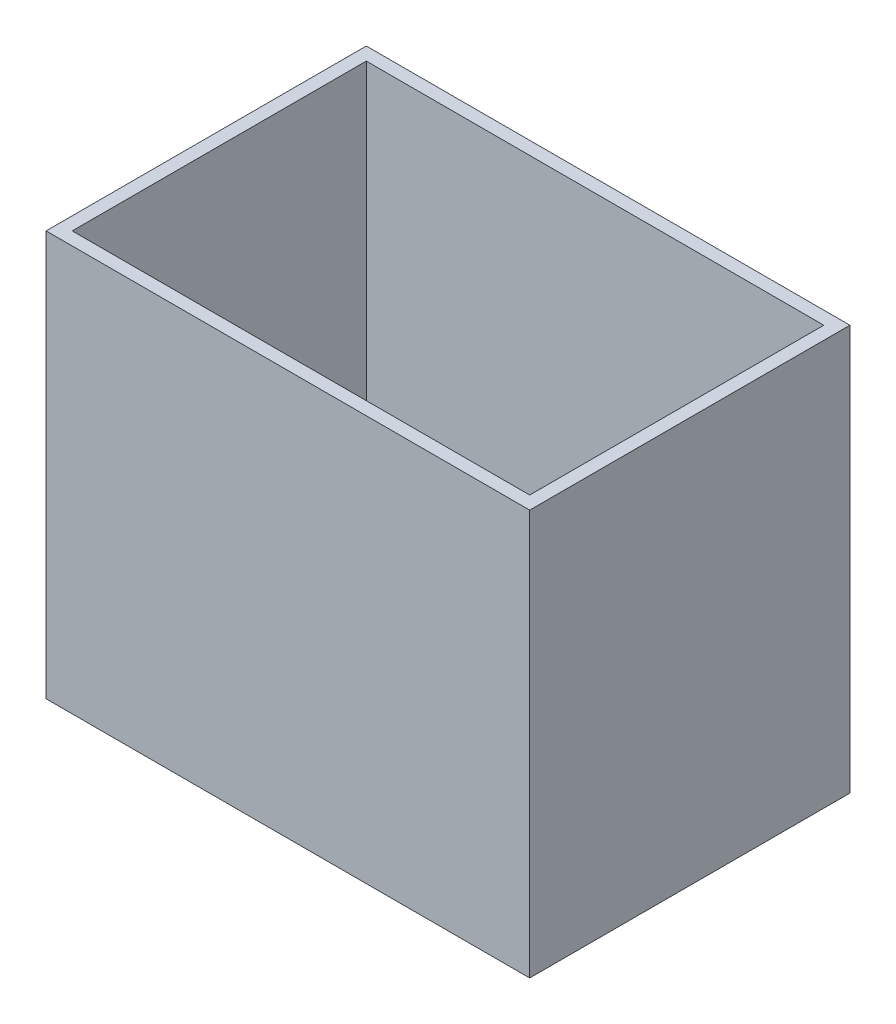
ISO-10303-21;
HEADER;
FILE_DESCRIPTION(('STEP AP214'),'2;1');
FILE_NAME('part.step','',(''),(''),'','','');
FILE_SCHEMA(('AUTOMOTIVE_DESIGN { 1 0 10303 214 1 1 1 1 }'));
ENDSEC;
DATA;
#1=APPLICATION_CONTEXT('core data for automotive mechanical design processes');
#2=APPLICATION_PROTOCOL_DEFINITION('international standard','automotive_design',2000,#1);
#3=PRODUCT_CONTEXT('',#1,'mechanical');
#4=PRODUCT('Part','Part','',(#3));
#5=PRODUCT_RELATED_PRODUCT_CATEGORY('part','',(#4));
#6=PRODUCT_DEFINITION_FORMATION('','',#4);
#7=PRODUCT_DEFINITION_CONTEXT('part definition',#1,'design');
#8=PRODUCT_DEFINITION('design','',#6,#7);
#9=PRODUCT_DEFINITION_SHAPE('','',#8);
#10=(LENGTH_UNIT() NAMED_UNIT(*) SI_UNIT(.MILLI.,.METRE.));
#11=(NAMED_UNIT(*) PLANE_ANGLE_UNIT() SI_UNIT($,.RADIAN.));
#12=(NAMED_UNIT(*) SI_UNIT($,.STERADIAN.) SOLID_ANGLE_UNIT());
#13=UNCERTAINTY_MEASURE_WITH_UNIT(LENGTH_MEASURE(1.E-05),#10,'distance_accuracy_value','');
#14=(GEOMETRIC_REPRESENTATION_CONTEXT(3) GLOBAL_UNCERTAINTY_ASSIGNED_CONTEXT((#13)) GLOBAL_UNIT_ASSIGNED_CONTEXT((#10,
#11,#12)) REPRESENTATION_CONTEXT('',''));
#15=CARTESIAN_POINT('',(0.,0.,0.));
#16=DIRECTION('',(0.,0.,1.));
#17=DIRECTION('',(1.,0.,0.));
#18=AXIS2_PLACEMENT_3D('',#15,#16,#17);
#19=CARTESIAN_POINT('',(0.,310.,72.5));
#20=DIRECTION('',(0.,0.,-1.));
#21=DIRECTION('',(-1.,0.,0.));
#22=AXIS2_PLACEMENT_3D('',#19,#20,#21);
#23=PLANE('',#22);
#24=DIRECTION('',(1.,0.,0.));
#25=VECTOR('',#24,1.);
#26=CARTESIAN_POINT('',(-175.,265.,72.5));
#27=LINE('',#26,#25);
#28=CARTESIAN_POINT('',(-175.,265.,72.5));
#29=VERTEX_POINT('',#28);
#30=CARTESIAN_POINT('',(175.,265.,72.5));
#31=VERTEX_POINT('',#30);
#32=EDGE_CURVE('E144',#29,#31,#27,.T.);
#33=ORIENTED_EDGE('',*,*,#32,.F.);
#34=DIRECTION('',(0.,-1.,0.));
#35=VECTOR('',#34,1.);
#36=CARTESIAN_POINT('',(-175.,310.,72.5));
#37=LINE('',#36,#35);
#38=CARTESIAN_POINT('',(-175.,10.,72.5));
#39=VERTEX_POINT('',#38);
#40=EDGE_CURVE('E140',#29,#39,#37,.T.);
#41=ORIENTED_EDGE('',*,*,#40,.T.);
#42=DIRECTION('',(1.,0.,0.));
#43=VECTOR('',#42,1.);
#44=CARTESIAN_POINT('',(0.,10.,72.5));
#45=LINE('',#44,#43);
#46=CARTESIAN_POINT('',(175.,10.,72.5));
#47=VERTEX_POINT('',#46);
#48=EDGE_CURVE('E247',#39,#47,#45,.T.);
#49=ORIENTED_EDGE('',*,*,#48,.T.);
#50=DIRECTION('',(0.,-1.,0.));
#51=VECTOR('',#50,1.);
#52=CARTESIAN_POINT('',(175.,310.,72.5));
#53=LINE('',#52,#51);
#54=EDGE_CURVE('E162',#31,#47,#53,.T.);
#55=ORIENTED_EDGE('',*,*,#54,.F.);
#56=EDGE_LOOP('',(#33,#41,#49,#55));
#57=FACE_BOUND('',#56,.T.);
#58=ADVANCED_FACE('F41',(#57),#23,.F.);
#59=CARTESIAN_POINT('',(0.,310.,67.5));
#60=DIRECTION('',(0.,0.,-1.));
#61=DIRECTION('',(-1.,0.,0.));
#62=AXIS2_PLACEMENT_3D('',#59,#60,#61);
#63=PLANE('',#62);
#64=DIRECTION('',(0.,-1.,0.));
#65=VECTOR('',#64,1.);
#66=CARTESIAN_POINT('',(-175.,310.,67.5));
#67=LINE('',#66,#65);
#68=CARTESIAN_POINT('',(-175.,265.,67.5));
#69=VERTEX_POINT('',#68);
#70=CARTESIAN_POINT('',(-175.,10.,67.5));
#71=VERTEX_POINT('',#70);
#72=EDGE_CURVE('E138',#69,#71,#67,.T.);
#73=ORIENTED_EDGE('',*,*,#72,.F.);
#74=DIRECTION('',(-1.,0.,0.));
#75=VECTOR('',#74,1.);
#76=CARTESIAN_POINT('',(175.,265.,67.5));
#77=LINE('',#76,#75);
#78=CARTESIAN_POINT('',(175.,265.,67.5));
#79=VERTEX_POINT('',#78);
#80=EDGE_CURVE('E145',#79,#69,#77,.T.);
#81=ORIENTED_EDGE('',*,*,#80,.F.);
#82=DIRECTION('',(0.,-1.,0.));
#83=VECTOR('',#82,1.);
#84=CARTESIAN_POINT('',(175.,310.,67.5));
#85=LINE('',#84,#83);
#86=CARTESIAN_POINT('',(175.,10.,67.5));
#87=VERTEX_POINT('',#86);
#88=EDGE_CURVE('E57',#79,#87,#85,.T.);
#89=ORIENTED_EDGE('',*,*,#88,.T.);
#90=DIRECTION('',(1.,0.,0.));
#91=VECTOR('',#90,1.);
#92=CARTESIAN_POINT('',(0.,10.,67.5));
#93=LINE('',#92,#91);
#94=EDGE_CURVE('E154',#71,#87,#93,.T.);
#95=ORIENTED_EDGE('',*,*,#94,.F.);
#96=EDGE_LOOP('',(#73,#81,#89,#95));
#97=FACE_BOUND('',#96,.T.);
#98=ADVANCED_FACE('F152',(#97),#63,.T.);
#99=CARTESIAN_POINT('',(185.,10.,122.5));
#100=DIRECTION('',(-1.,0.,0.));
#101=DIRECTION('',(0.,0.,1.));
#102=AXIS2_PLACEMENT_3D('',#99,#100,#101);
#103=PLANE('',#102);
#104=DIRECTION('',(0.,0.,-1.));
#105=VECTOR('',#104,1.);
#106=CARTESIAN_POINT('',(185.,0.,122.5));
#107=LINE('',#106,#105);
#108=CARTESIAN_POINT('',(185.,0.,122.5));
#109=VERTEX_POINT('',#108);
#110=CARTESIAN_POINT('',(185.,0.,-122.5));
#111=VERTEX_POINT('',#110);
#112=EDGE_CURVE('E172',#109,#111,#107,.T.);
#113=ORIENTED_EDGE('',*,*,#112,.T.);
#114=DIRECTION('',(0.,-1.,0.));
#115=VECTOR('',#114,1.);
#116=CARTESIAN_POINT('',(185.,10.,-122.5));
#117=LINE('',#116,#115);
#118=CARTESIAN_POINT('',(185.,310.,-122.5));
#119=VERTEX_POINT('',#118);
#120=EDGE_CURVE('E11',#119,#111,#117,.T.);
#121=ORIENTED_EDGE('',*,*,#120,.F.);
#122=DIRECTION('',(0.,0.,-1.));
#123=VECTOR('',#122,1.);
#124=CARTESIAN_POINT('',(185.,310.,0.));
#125=LINE('',#124,#123);
#126=CARTESIAN_POINT('',(185.,310.,122.5));
#127=VERTEX_POINT('',#126);
#128=EDGE_CURVE('E221',#127,#119,#125,.T.);
#129=ORIENTED_EDGE('',*,*,#128,.F.);
#130=DIRECTION('',(0.,-1.,0.));
#131=VECTOR('',#130,1.);
#132=CARTESIAN_POINT('',(185.,10.,122.5));
#133=LINE('',#132,#131);
#134=EDGE_CURVE('E194',#127,#109,#133,.T.);
#135=ORIENTED_EDGE('',*,*,#134,.T.);
#136=EDGE_LOOP('',(#113,#121,#129,#135));
#137=FACE_BOUND('',#136,.T.);
#138=ADVANCED_FACE('F43',(#137),#103,.F.);
#139=CARTESIAN_POINT('',(-185.,10.,-122.5));
#140=DIRECTION('',(0.,0.,1.));
#141=DIRECTION('',(1.,0.,0.));
#142=AXIS2_PLACEMENT_3D('',#139,#140,#141);
#143=PLANE('',#142);
#144=DIRECTION('',(-1.,0.,0.));
#145=VECTOR('',#144,1.);
#146=CARTESIAN_POINT('',(-185.,0.,-122.5));
#147=LINE('',#146,#145);
#148=CARTESIAN_POINT('',(-185.,0.,-122.5));
#149=VERTEX_POINT('',#148);
#150=EDGE_CURVE('E185',#111,#149,#147,.T.);
#151=ORIENTED_EDGE('',*,*,#150,.T.);
#152=DIRECTION('',(0.,-1.,0.));
#153=VECTOR('',#152,1.);
#154=CARTESIAN_POINT('',(-185.,10.,-122.5));
#155=LINE('',#154,#153);
#156=CARTESIAN_POINT('',(-185.,310.,-122.5));
#157=VERTEX_POINT('',#156);
#158=EDGE_CURVE('E50',#157,#149,#155,.T.);
#159=ORIENTED_EDGE('',*,*,#158,.F.);
#160=DIRECTION('',(-1.,0.,0.));
#161=VECTOR('',#160,1.);
#162=CARTESIAN_POINT('',(0.,310.,-122.5));
#163=LINE('',#162,#161);
#164=EDGE_CURVE('E225',#119,#157,#163,.T.);
#165=ORIENTED_EDGE('',*,*,#164,.F.);
#166=ORIENTED_EDGE('',*,*,#120,.T.);
#167=EDGE_LOOP('',(#151,#159,#165,#166));
#168=FACE_BOUND('',#167,.T.);
#169=ADVANCED_FACE('F319',(#168),#143,.F.);
#170=CARTESIAN_POINT('',(-185.,10.,122.5));
#171=DIRECTION('',(1.,0.,0.));
#172=DIRECTION('',(0.,0.,-1.));
#173=AXIS2_PLACEMENT_3D('',#170,#171,#172);
#174=PLANE('',#173);
#175=DIRECTION('',(0.,0.,1.));
#176=VECTOR('',#175,1.);
#177=CARTESIAN_POINT('',(-185.,0.,122.5));
#178=LINE('',#177,#176);
#179=CARTESIAN_POINT('',(-185.,0.,122.5));
#180=VERTEX_POINT('',#179);
#181=EDGE_CURVE('E188',#149,#180,#178,.T.);
#182=ORIENTED_EDGE('',*,*,#181,.T.);
#183=DIRECTION('',(0.,-1.,0.));
#184=VECTOR('',#183,1.);
#185=CARTESIAN_POINT('',(-185.,10.,122.5));
#186=LINE('',#185,#184);
#187=CARTESIAN_POINT('',(-185.,310.,122.5));
#188=VERTEX_POINT('',#187);
#189=EDGE_CURVE('E198',#188,#180,#186,.T.);
#190=ORIENTED_EDGE('',*,*,#189,.F.);
#191=DIRECTION('',(0.,0.,1.));
#192=VECTOR('',#191,1.);
#193=CARTESIAN_POINT('',(-185.,310.,0.));
#194=LINE('',#193,#192);
#195=EDGE_CURVE('E177',#157,#188,#194,.T.);
#196=ORIENTED_EDGE('',*,*,#195,.F.);
#197=ORIENTED_EDGE('',*,*,#158,.T.);
#198=EDGE_LOOP('',(#182,#190,#196,#197));
#199=FACE_BOUND('',#198,.T.);
#200=ADVANCED_FACE('F206',(#199),#174,.F.);
#201=CARTESIAN_POINT('',(-185.,10.,122.5));
#202=DIRECTION('',(0.,0.,-1.));
#203=DIRECTION('',(-1.,0.,0.));
#204=AXIS2_PLACEMENT_3D('',#201,#202,#203);
#205=PLANE('',#204);
#206=DIRECTION('',(1.,0.,0.));
#207=VECTOR('',#206,1.);
#208=CARTESIAN_POINT('',(-185.,0.,122.5));
#209=LINE('',#208,#207);
#210=EDGE_CURVE('E191',#180,#109,#209,.T.);
#211=ORIENTED_EDGE('',*,*,#210,.T.);
#212=ORIENTED_EDGE('',*,*,#134,.F.);
#213=DIRECTION('',(1.,0.,0.));
#214=VECTOR('',#213,1.);
#215=CARTESIAN_POINT('',(0.,310.,122.5));
#216=LINE('',#215,#214);
#217=EDGE_CURVE('E226',#188,#127,#216,.T.);
#218=ORIENTED_EDGE('',*,*,#217,.F.);
#219=ORIENTED_EDGE('',*,*,#189,.T.);
#220=EDGE_LOOP('',(#211,#212,#218,#219));
#221=FACE_BOUND('',#220,.T.);
#222=ADVANCED_FACE('F216',(#221),#205,.F.);
#223=CARTESIAN_POINT('',(0.,0.,0.));
#224=DIRECTION('',(0.,-1.,0.));
#225=DIRECTION('',(0.,0.,-1.));
#226=AXIS2_PLACEMENT_3D('',#223,#224,#225);
#227=PLANE('',#226);
#228=ORIENTED_EDGE('',*,*,#112,.F.);
#229=ORIENTED_EDGE('',*,*,#210,.F.);
#230=ORIENTED_EDGE('',*,*,#181,.F.);
#231=ORIENTED_EDGE('',*,*,#150,.F.);
#232=EDGE_LOOP('',(#228,#229,#230,#231));
#233=FACE_BOUND('',#232,.T.);
#234=ADVANCED_FACE('F214',(#233),#227,.T.);
#235=CARTESIAN_POINT('',(-175.,310.,0.));
#236=DIRECTION('',(1.,0.,0.));
#237=DIRECTION('',(0.,0.,-1.));
#238=AXIS2_PLACEMENT_3D('',#235,#236,#237);
#239=PLANE('',#238);
#240=DIRECTION('',(0.,0.,1.));
#241=VECTOR('',#240,1.);
#242=CARTESIAN_POINT('',(-175.,10.,0.));
#243=LINE('',#242,#241);
#244=CARTESIAN_POINT('',(-175.,10.,-112.5));
#245=VERTEX_POINT('',#244);
#246=EDGE_CURVE('E248',#245,#71,#243,.T.);
#247=ORIENTED_EDGE('',*,*,#246,.F.);
#248=DIRECTION('',(0.,-1.,0.));
#249=VECTOR('',#248,1.);
#250=CARTESIAN_POINT('',(-175.,310.,-112.5));
#251=LINE('',#250,#249);
#252=CARTESIAN_POINT('',(-175.,310.,-112.5));
#253=VERTEX_POINT('',#252);
#254=EDGE_CURVE('E169',#253,#245,#251,.T.);
#255=ORIENTED_EDGE('',*,*,#254,.F.);
#256=DIRECTION('',(0.,0.,1.));
#257=VECTOR('',#256,1.);
#258=CARTESIAN_POINT('',(-175.,310.,0.));
#259=LINE('',#258,#257);
#260=CARTESIAN_POINT('',(-175.,310.,112.5));
#261=VERTEX_POINT('',#260);
#262=EDGE_CURVE('E268',#253,#261,#259,.T.);
#263=ORIENTED_EDGE('',*,*,#262,.T.);
#264=DIRECTION('',(0.,-1.,0.));
#265=VECTOR('',#264,1.);
#266=CARTESIAN_POINT('',(-175.,310.,112.5));
#267=LINE('',#266,#265);
#268=CARTESIAN_POINT('',(-175.,10.,112.5));
#269=VERTEX_POINT('',#268);
#270=EDGE_CURVE('E173',#261,#269,#267,.T.);
#271=ORIENTED_EDGE('',*,*,#270,.T.);
#272=EDGE_CURVE('E243',#39,#269,#243,.T.);
#273=ORIENTED_EDGE('',*,*,#272,.F.);
#274=ORIENTED_EDGE('',*,*,#40,.F.);
#275=DIRECTION('',(0.,0.,1.));
#276=VECTOR('',#275,1.);
#277=CARTESIAN_POINT('',(-175.,265.,67.5));
#278=LINE('',#277,#276);
#279=EDGE_CURVE('E133',#69,#29,#278,.T.);
#280=ORIENTED_EDGE('',*,*,#279,.F.);
#281=ORIENTED_EDGE('',*,*,#72,.T.);
#282=EDGE_LOOP('',(#247,#255,#263,#271,#273,#274,#280,#281));
#283=FACE_BOUND('',#282,.T.);
#284=ADVANCED_FACE('F136',(#283),#239,.T.);
#285=CARTESIAN_POINT('',(0.,310.,-112.5));
#286=DIRECTION('',(0.,0.,1.));
#287=DIRECTION('',(1.,0.,0.));
#288=AXIS2_PLACEMENT_3D('',#285,#286,#287);
#289=PLANE('',#288);
#290=DIRECTION('',(-1.,0.,0.));
#291=VECTOR('',#290,1.);
#292=CARTESIAN_POINT('',(0.,10.,-112.5));
#293=LINE('',#292,#291);
#294=CARTESIAN_POINT('',(175.,10.,-112.5));
#295=VERTEX_POINT('',#294);
#296=EDGE_CURVE('E258',#295,#245,#293,.T.);
#297=ORIENTED_EDGE('',*,*,#296,.F.);
#298=DIRECTION('',(0.,-1.,0.));
#299=VECTOR('',#298,1.);
#300=CARTESIAN_POINT('',(175.,310.,-112.5));
#301=LINE('',#300,#299);
#302=CARTESIAN_POINT('',(175.,310.,-112.5));
#303=VERTEX_POINT('',#302);
#304=EDGE_CURVE('E160',#303,#295,#301,.T.);
#305=ORIENTED_EDGE('',*,*,#304,.F.);
#306=DIRECTION('',(-1.,0.,0.));
#307=VECTOR('',#306,1.);
#308=CARTESIAN_POINT('',(0.,310.,-112.5));
#309=LINE('',#308,#307);
#310=EDGE_CURVE('E234',#303,#253,#309,.T.);
#311=ORIENTED_EDGE('',*,*,#310,.T.);
#312=ORIENTED_EDGE('',*,*,#254,.T.);
#313=EDGE_LOOP('',(#297,#305,#311,#312));
#314=FACE_BOUND('',#313,.T.);
#315=ADVANCED_FACE('F279',(#314),#289,.T.);
#316=CARTESIAN_POINT('',(175.,310.,0.));
#317=DIRECTION('',(-1.,0.,0.));
#318=DIRECTION('',(0.,0.,1.));
#319=AXIS2_PLACEMENT_3D('',#316,#317,#318);
#320=PLANE('',#319);
#321=DIRECTION('',(0.,0.,-1.));
#322=VECTOR('',#321,1.);
#323=CARTESIAN_POINT('',(175.,10.,0.));
#324=LINE('',#323,#322);
#325=EDGE_CURVE('E255',#87,#295,#324,.T.);
#326=ORIENTED_EDGE('',*,*,#325,.F.);
#327=ORIENTED_EDGE('',*,*,#88,.F.);
#328=DIRECTION('',(0.,0.,-1.));
#329=VECTOR('',#328,1.);
#330=CARTESIAN_POINT('',(175.,265.,67.5));
#331=LINE('',#330,#329);
#332=EDGE_CURVE('E149',#31,#79,#331,.T.);
#333=ORIENTED_EDGE('',*,*,#332,.F.);
#334=ORIENTED_EDGE('',*,*,#54,.T.);
#335=CARTESIAN_POINT('',(175.,10.,112.5));
#336=VERTEX_POINT('',#335);
#337=EDGE_CURVE('E65',#336,#47,#324,.T.);
#338=ORIENTED_EDGE('',*,*,#337,.F.);
#339=DIRECTION('',(0.,-1.,0.));
#340=VECTOR('',#339,1.);
#341=CARTESIAN_POINT('',(175.,310.,112.5));
#342=LINE('',#341,#340);
#343=CARTESIAN_POINT('',(175.,310.,112.5));
#344=VERTEX_POINT('',#343);
#345=EDGE_CURVE('E176',#344,#336,#342,.T.);
#346=ORIENTED_EDGE('',*,*,#345,.F.);
#347=DIRECTION('',(0.,0.,-1.));
#348=VECTOR('',#347,1.);
#349=CARTESIAN_POINT('',(175.,310.,0.));
#350=LINE('',#349,#348);
#351=EDGE_CURVE('E230',#344,#303,#350,.T.);
#352=ORIENTED_EDGE('',*,*,#351,.T.);
#353=ORIENTED_EDGE('',*,*,#304,.T.);
#354=EDGE_LOOP('',(#326,#327,#333,#334,#338,#346,#352,#353));
#355=FACE_BOUND('',#354,.T.);
#356=ADVANCED_FACE('F290',(#355),#320,.T.);
#357=CARTESIAN_POINT('',(0.,310.,112.5));
#358=DIRECTION('',(0.,0.,-1.));
#359=DIRECTION('',(-1.,0.,0.));
#360=AXIS2_PLACEMENT_3D('',#357,#358,#359);
#361=PLANE('',#360);
#362=DIRECTION('',(1.,0.,0.));
#363=VECTOR('',#362,1.);
#364=CARTESIAN_POINT('',(0.,10.,112.5));
#365=LINE('',#364,#363);
#366=EDGE_CURVE('E254',#269,#336,#365,.T.);
#367=ORIENTED_EDGE('',*,*,#366,.F.);
#368=ORIENTED_EDGE('',*,*,#270,.F.);
#369=DIRECTION('',(1.,0.,0.));
#370=VECTOR('',#369,1.);
#371=CARTESIAN_POINT('',(0.,310.,112.5));
#372=LINE('',#371,#370);
#373=EDGE_CURVE('E276',#261,#344,#372,.T.);
#374=ORIENTED_EDGE('',*,*,#373,.T.);
#375=ORIENTED_EDGE('',*,*,#345,.T.);
#376=EDGE_LOOP('',(#367,#368,#374,#375));
#377=FACE_BOUND('',#376,.T.);
#378=ADVANCED_FACE('F295',(#377),#361,.T.);
#379=CARTESIAN_POINT('',(0.,310.,0.));
#380=DIRECTION('',(0.,1.,0.));
#381=DIRECTION('',(0.,0.,1.));
#382=AXIS2_PLACEMENT_3D('',#379,#380,#381);
#383=PLANE('',#382);
#384=ORIENTED_EDGE('',*,*,#351,.F.);
#385=ORIENTED_EDGE('',*,*,#373,.F.);
#386=ORIENTED_EDGE('',*,*,#262,.F.);
#387=ORIENTED_EDGE('',*,*,#310,.F.);
#388=EDGE_LOOP('',(#384,#385,#386,#387));
#389=FACE_BOUND('',#388,.T.);
#390=ORIENTED_EDGE('',*,*,#217,.T.);
#391=ORIENTED_EDGE('',*,*,#128,.T.);
#392=ORIENTED_EDGE('',*,*,#164,.T.);
#393=ORIENTED_EDGE('',*,*,#195,.T.);
#394=EDGE_LOOP('',(#390,#391,#392,#393));
#395=FACE_BOUND('',#394,.T.);
#396=ADVANCED_FACE('F228',(#389,#395),#383,.T.);
#397=CARTESIAN_POINT('',(0.,10.,0.));
#398=DIRECTION('',(0.,-1.,0.));
#399=DIRECTION('',(0.,0.,-1.));
#400=AXIS2_PLACEMENT_3D('',#397,#398,#399);
#401=PLANE('',#400);
#402=ORIENTED_EDGE('',*,*,#48,.F.);
#403=ORIENTED_EDGE('',*,*,#272,.T.);
#404=ORIENTED_EDGE('',*,*,#366,.T.);
#405=ORIENTED_EDGE('',*,*,#337,.T.);
#406=EDGE_LOOP('',(#402,#403,#404,#405));
#407=FACE_BOUND('',#406,.T.);
#408=ADVANCED_FACE('F293',(#407),#401,.F.);
#409=ORIENTED_EDGE('',*,*,#296,.T.);
#410=ORIENTED_EDGE('',*,*,#246,.T.);
#411=ORIENTED_EDGE('',*,*,#94,.T.);
#412=ORIENTED_EDGE('',*,*,#325,.T.);
#413=EDGE_LOOP('',(#409,#410,#411,#412));
#414=FACE_BOUND('',#413,.T.);
#415=ADVANCED_FACE('F266',(#414),#401,.F.);
#416=CARTESIAN_POINT('',(0.,265.,0.));
#417=DIRECTION('',(0.,1.,0.));
#418=DIRECTION('',(0.,0.,1.));
#419=AXIS2_PLACEMENT_3D('',#416,#417,#418);
#420=PLANE('',#419);
#421=ORIENTED_EDGE('',*,*,#80,.T.);
#422=ORIENTED_EDGE('',*,*,#279,.T.);
#423=ORIENTED_EDGE('',*,*,#32,.T.);
#424=ORIENTED_EDGE('',*,*,#332,.T.);
#425=EDGE_LOOP('',(#421,#422,#423,#424));
#426=FACE_BOUND('',#425,.T.);
#427=ADVANCED_FACE('F147',(#426),#420,.T.);
#428=CLOSED_SHELL('',(#58,#98,#138,#169,#200,#222,#234,#284,#315,#356,#378,#396,#408,#415,#427));
#429=MANIFOLD_SOLID_BREP('B2',#428);
#430=ADVANCED_BREP_SHAPE_REPRESENTATION('',(#18,#429),#14);
#431=SHAPE_DEFINITION_REPRESENTATION(#9,#430);
ENDSEC;
END-ISO-10303-21;
